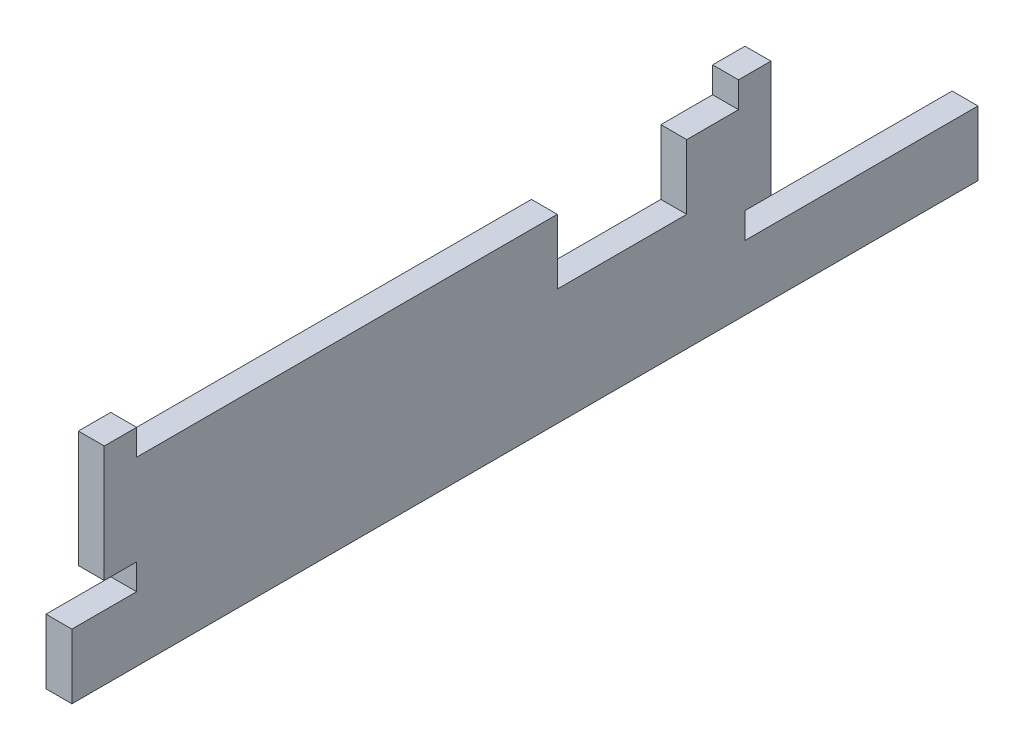
ISO-10303-21;
HEADER;
FILE_DESCRIPTION(('STEP AP214'),'2;1');
FILE_NAME('part.step','',(''),(''),'','','');
FILE_SCHEMA(('AUTOMOTIVE_DESIGN { 1 0 10303 214 1 1 1 1 }'));
ENDSEC;
DATA;
#1=APPLICATION_CONTEXT('core data for automotive mechanical design processes');
#2=APPLICATION_PROTOCOL_DEFINITION('international standard','automotive_design',2000,#1);
#3=PRODUCT_CONTEXT('',#1,'mechanical');
#4=PRODUCT('Part','Part','',(#3));
#5=PRODUCT_RELATED_PRODUCT_CATEGORY('part','',(#4));
#6=PRODUCT_DEFINITION_FORMATION('','',#4);
#7=PRODUCT_DEFINITION_CONTEXT('part definition',#1,'design');
#8=PRODUCT_DEFINITION('design','',#6,#7);
#9=PRODUCT_DEFINITION_SHAPE('','',#8);
#10=(LENGTH_UNIT() NAMED_UNIT(*) SI_UNIT(.MILLI.,.METRE.));
#11=(NAMED_UNIT(*) PLANE_ANGLE_UNIT() SI_UNIT($,.RADIAN.));
#12=(NAMED_UNIT(*) SI_UNIT($,.STERADIAN.) SOLID_ANGLE_UNIT());
#13=UNCERTAINTY_MEASURE_WITH_UNIT(LENGTH_MEASURE(1.E-05),#10,'distance_accuracy_value','');
#14=(GEOMETRIC_REPRESENTATION_CONTEXT(3) GLOBAL_UNCERTAINTY_ASSIGNED_CONTEXT((#13)) GLOBAL_UNIT_ASSIGNED_CONTEXT((#10,
#11,#12)) REPRESENTATION_CONTEXT('',''));
#15=CARTESIAN_POINT('',(0.,0.,0.));
#16=DIRECTION('',(0.,0.,1.));
#17=DIRECTION('',(1.,0.,0.));
#18=AXIS2_PLACEMENT_3D('',#15,#16,#17);
#19=CARTESIAN_POINT('',(4.,9.34482146794553,25.8310136523351));
#20=DIRECTION('',(0.,-1.,0.));
#21=DIRECTION('',(0.,0.,-1.));
#22=AXIS2_PLACEMENT_3D('',#19,#20,#21);
#23=PLANE('',#22);
#24=DIRECTION('',(0.,0.,1.));
#25=VECTOR('',#24,1.);
#26=CARTESIAN_POINT('',(0.,9.34482146794553,25.8310136523351));
#27=LINE('',#26,#25);
#28=CARTESIAN_POINT('',(0.,9.34482146794553,5.83101365233506));
#29=VERTEX_POINT('',#28);
#30=CARTESIAN_POINT('',(0.,9.34482146794553,25.8310136523351));
#31=VERTEX_POINT('',#30);
#32=EDGE_CURVE('E212',#29,#31,#27,.T.);
#33=ORIENTED_EDGE('',*,*,#32,.T.);
#34=DIRECTION('',(-1.,0.,0.));
#35=VECTOR('',#34,1.);
#36=CARTESIAN_POINT('',(4.,9.34482146794553,25.8310136523351));
#37=LINE('',#36,#35);
#38=CARTESIAN_POINT('',(4.,9.34482146794553,25.8310136523351));
#39=VERTEX_POINT('',#38);
#40=EDGE_CURVE('E11',#39,#31,#37,.T.);
#41=ORIENTED_EDGE('',*,*,#40,.F.);
#42=DIRECTION('',(0.,0.,1.));
#43=VECTOR('',#42,1.);
#44=CARTESIAN_POINT('',(4.,9.34482146794553,25.8310136523351));
#45=LINE('',#44,#43);
#46=CARTESIAN_POINT('',(4.,9.34482146794553,5.83101365233506));
#47=VERTEX_POINT('',#46);
#48=EDGE_CURVE('E270',#47,#39,#45,.T.);
#49=ORIENTED_EDGE('',*,*,#48,.F.);
#50=DIRECTION('',(-1.,0.,0.));
#51=VECTOR('',#50,1.);
#52=CARTESIAN_POINT('',(4.,9.34482146794553,5.83101365233506));
#53=LINE('',#52,#51);
#54=EDGE_CURVE('E208',#47,#29,#53,.T.);
#55=ORIENTED_EDGE('',*,*,#54,.T.);
#56=EDGE_LOOP('',(#33,#41,#49,#55));
#57=FACE_BOUND('',#56,.T.);
#58=ADVANCED_FACE('F39',(#57),#23,.F.);
#59=CARTESIAN_POINT('',(4.,19.3448214679455,25.8310136523351));
#60=DIRECTION('',(0.,0.,1.));
#61=DIRECTION('',(1.,0.,0.));
#62=AXIS2_PLACEMENT_3D('',#59,#60,#61);
#63=PLANE('',#62);
#64=DIRECTION('',(0.,1.,0.));
#65=VECTOR('',#64,1.);
#66=CARTESIAN_POINT('',(0.,19.3448214679455,25.8310136523351));
#67=LINE('',#66,#65);
#68=CARTESIAN_POINT('',(0.,19.3448214679455,25.8310136523351));
#69=VERTEX_POINT('',#68);
#70=EDGE_CURVE('E216',#31,#69,#67,.T.);
#71=ORIENTED_EDGE('',*,*,#70,.T.);
#72=DIRECTION('',(-1.,0.,0.));
#73=VECTOR('',#72,1.);
#74=CARTESIAN_POINT('',(4.,19.3448214679455,25.8310136523351));
#75=LINE('',#74,#73);
#76=CARTESIAN_POINT('',(4.,19.3448214679455,25.8310136523351));
#77=VERTEX_POINT('',#76);
#78=EDGE_CURVE('E48',#77,#69,#75,.T.);
#79=ORIENTED_EDGE('',*,*,#78,.F.);
#80=DIRECTION('',(0.,1.,0.));
#81=VECTOR('',#80,1.);
#82=CARTESIAN_POINT('',(4.,19.3448214679455,25.8310136523351));
#83=LINE('',#82,#81);
#84=EDGE_CURVE('E135',#39,#77,#83,.T.);
#85=ORIENTED_EDGE('',*,*,#84,.F.);
#86=ORIENTED_EDGE('',*,*,#40,.T.);
#87=EDGE_LOOP('',(#71,#79,#85,#86));
#88=FACE_BOUND('',#87,.T.);
#89=ADVANCED_FACE('F420',(#88),#63,.F.);
#90=CARTESIAN_POINT('',(4.,19.3448214679455,90.8310136523351));
#91=DIRECTION('',(0.,-1.,0.));
#92=DIRECTION('',(0.,0.,-1.));
#93=AXIS2_PLACEMENT_3D('',#90,#91,#92);
#94=PLANE('',#93);
#95=DIRECTION('',(0.,0.,1.));
#96=VECTOR('',#95,1.);
#97=CARTESIAN_POINT('',(0.,19.3448214679455,90.8310136523351));
#98=LINE('',#97,#96);
#99=CARTESIAN_POINT('',(0.,19.3448214679455,90.8310136523351));
#100=VERTEX_POINT('',#99);
#101=EDGE_CURVE('E219',#69,#100,#98,.T.);
#102=ORIENTED_EDGE('',*,*,#101,.T.);
#103=DIRECTION('',(-1.,0.,0.));
#104=VECTOR('',#103,1.);
#105=CARTESIAN_POINT('',(4.,19.3448214679455,90.8310136523351));
#106=LINE('',#105,#104);
#107=CARTESIAN_POINT('',(4.,19.3448214679455,90.8310136523351));
#108=VERTEX_POINT('',#107);
#109=EDGE_CURVE('E329',#108,#100,#106,.T.);
#110=ORIENTED_EDGE('',*,*,#109,.F.);
#111=DIRECTION('',(0.,0.,1.));
#112=VECTOR('',#111,1.);
#113=CARTESIAN_POINT('',(4.,19.3448214679455,90.8310136523351));
#114=LINE('',#113,#112);
#115=EDGE_CURVE('E339',#77,#108,#114,.T.);
#116=ORIENTED_EDGE('',*,*,#115,.F.);
#117=ORIENTED_EDGE('',*,*,#78,.T.);
#118=EDGE_LOOP('',(#102,#110,#116,#117));
#119=FACE_BOUND('',#118,.T.);
#120=ADVANCED_FACE('F337',(#119),#94,.F.);
#121=CARTESIAN_POINT('',(4.,19.3448214679455,90.8310136523351));
#122=DIRECTION('',(0.,0.,1.));
#123=DIRECTION('',(0.,-1.,0.));
#124=AXIS2_PLACEMENT_3D('',#121,#122,#123);
#125=PLANE('',#124);
#126=DIRECTION('',(0.,1.,0.));
#127=VECTOR('',#126,1.);
#128=CARTESIAN_POINT('',(0.,19.3448214679455,90.8310136523351));
#129=LINE('',#128,#127);
#130=CARTESIAN_POINT('',(0.,23.3448214679455,90.831013652335));
#131=VERTEX_POINT('',#130);
#132=EDGE_CURVE('E222',#100,#131,#129,.T.);
#133=ORIENTED_EDGE('',*,*,#132,.T.);
#134=DIRECTION('',(-1.,0.,0.));
#135=VECTOR('',#134,1.);
#136=CARTESIAN_POINT('',(4.,23.3448214679455,90.831013652335));
#137=LINE('',#136,#135);
#138=CARTESIAN_POINT('',(4.,23.3448214679455,90.831013652335));
#139=VERTEX_POINT('',#138);
#140=EDGE_CURVE('E325',#139,#131,#137,.T.);
#141=ORIENTED_EDGE('',*,*,#140,.F.);
#142=DIRECTION('',(0.,1.,0.));
#143=VECTOR('',#142,1.);
#144=CARTESIAN_POINT('',(4.,19.3448214679455,90.8310136523351));
#145=LINE('',#144,#143);
#146=EDGE_CURVE('E358',#108,#139,#145,.T.);
#147=ORIENTED_EDGE('',*,*,#146,.F.);
#148=ORIENTED_EDGE('',*,*,#109,.T.);
#149=EDGE_LOOP('',(#133,#141,#147,#148));
#150=FACE_BOUND('',#149,.T.);
#151=ADVANCED_FACE('F348',(#150),#125,.F.);
#152=CARTESIAN_POINT('',(4.,23.3448214679455,90.831013652335));
#153=DIRECTION('',(0.,-1.,0.));
#154=DIRECTION('',(0.,0.,-1.));
#155=AXIS2_PLACEMENT_3D('',#152,#153,#154);
#156=PLANE('',#155);
#157=DIRECTION('',(0.,0.,1.));
#158=VECTOR('',#157,1.);
#159=CARTESIAN_POINT('',(0.,23.3448214679455,90.831013652335));
#160=LINE('',#159,#158);
#161=CARTESIAN_POINT('',(0.,23.3448214679455,95.8310136523351));
#162=VERTEX_POINT('',#161);
#163=EDGE_CURVE('E225',#131,#162,#160,.T.);
#164=ORIENTED_EDGE('',*,*,#163,.T.);
#165=DIRECTION('',(-1.,0.,0.));
#166=VECTOR('',#165,1.);
#167=CARTESIAN_POINT('',(4.,23.3448214679455,95.8310136523351));
#168=LINE('',#167,#166);
#169=CARTESIAN_POINT('',(4.,23.3448214679455,95.8310136523351));
#170=VERTEX_POINT('',#169);
#171=EDGE_CURVE('E321',#170,#162,#168,.T.);
#172=ORIENTED_EDGE('',*,*,#171,.F.);
#173=DIRECTION('',(0.,0.,1.));
#174=VECTOR('',#173,1.);
#175=CARTESIAN_POINT('',(4.,23.3448214679455,90.831013652335));
#176=LINE('',#175,#174);
#177=EDGE_CURVE('E354',#139,#170,#176,.T.);
#178=ORIENTED_EDGE('',*,*,#177,.F.);
#179=ORIENTED_EDGE('',*,*,#140,.T.);
#180=EDGE_LOOP('',(#164,#172,#178,#179));
#181=FACE_BOUND('',#180,.T.);
#182=ADVANCED_FACE('F352',(#181),#156,.F.);
#183=CARTESIAN_POINT('',(4.,23.3448214679455,95.8310136523351));
#184=DIRECTION('',(0.,0.,-1.));
#185=DIRECTION('',(0.,1.,0.));
#186=AXIS2_PLACEMENT_3D('',#183,#184,#185);
#187=PLANE('',#186);
#188=DIRECTION('',(0.,-1.,0.));
#189=VECTOR('',#188,1.);
#190=CARTESIAN_POINT('',(0.,23.3448214679455,95.8310136523351));
#191=LINE('',#190,#189);
#192=CARTESIAN_POINT('',(0.,5.34482146794554,95.8310136523351));
#193=VERTEX_POINT('',#192);
#194=EDGE_CURVE('E228',#162,#193,#191,.T.);
#195=ORIENTED_EDGE('',*,*,#194,.T.);
#196=DIRECTION('',(-1.,0.,0.));
#197=VECTOR('',#196,1.);
#198=CARTESIAN_POINT('',(4.,5.34482146794554,95.8310136523351));
#199=LINE('',#198,#197);
#200=CARTESIAN_POINT('',(4.,5.34482146794554,95.8310136523351));
#201=VERTEX_POINT('',#200);
#202=EDGE_CURVE('E317',#201,#193,#199,.T.);
#203=ORIENTED_EDGE('',*,*,#202,.F.);
#204=DIRECTION('',(0.,-1.,0.));
#205=VECTOR('',#204,1.);
#206=CARTESIAN_POINT('',(4.,23.3448214679455,95.8310136523351));
#207=LINE('',#206,#205);
#208=EDGE_CURVE('E357',#170,#201,#207,.T.);
#209=ORIENTED_EDGE('',*,*,#208,.F.);
#210=ORIENTED_EDGE('',*,*,#171,.T.);
#211=EDGE_LOOP('',(#195,#203,#209,#210));
#212=FACE_BOUND('',#211,.T.);
#213=ADVANCED_FACE('F433',(#212),#187,.F.);
#214=CARTESIAN_POINT('',(4.,5.34482146794554,95.8310136523351));
#215=DIRECTION('',(0.,1.,0.));
#216=DIRECTION('',(0.,0.,1.));
#217=AXIS2_PLACEMENT_3D('',#214,#215,#216);
#218=PLANE('',#217);
#219=DIRECTION('',(0.,0.,-1.));
#220=VECTOR('',#219,1.);
#221=CARTESIAN_POINT('',(0.,5.34482146794554,95.8310136523351));
#222=LINE('',#221,#220);
#223=CARTESIAN_POINT('',(0.,5.34482146794554,90.8310136523351));
#224=VERTEX_POINT('',#223);
#225=EDGE_CURVE('E231',#193,#224,#222,.T.);
#226=ORIENTED_EDGE('',*,*,#225,.T.);
#227=DIRECTION('',(-1.,0.,0.));
#228=VECTOR('',#227,1.);
#229=CARTESIAN_POINT('',(4.,5.34482146794554,90.8310136523351));
#230=LINE('',#229,#228);
#231=CARTESIAN_POINT('',(4.,5.34482146794554,90.8310136523351));
#232=VERTEX_POINT('',#231);
#233=EDGE_CURVE('E313',#232,#224,#230,.T.);
#234=ORIENTED_EDGE('',*,*,#233,.F.);
#235=DIRECTION('',(0.,0.,-1.));
#236=VECTOR('',#235,1.);
#237=CARTESIAN_POINT('',(4.,5.34482146794554,95.8310136523351));
#238=LINE('',#237,#236);
#239=EDGE_CURVE('E362',#201,#232,#238,.T.);
#240=ORIENTED_EDGE('',*,*,#239,.F.);
#241=ORIENTED_EDGE('',*,*,#202,.T.);
#242=EDGE_LOOP('',(#226,#234,#240,#241));
#243=FACE_BOUND('',#242,.T.);
#244=ADVANCED_FACE('F436',(#243),#218,.F.);
#245=CARTESIAN_POINT('',(4.,5.34482146794554,90.8310136523351));
#246=DIRECTION('',(0.,0.,-1.));
#247=DIRECTION('',(-1.,0.,0.));
#248=AXIS2_PLACEMENT_3D('',#245,#246,#247);
#249=PLANE('',#248);
#250=DIRECTION('',(0.,-1.,0.));
#251=VECTOR('',#250,1.);
#252=CARTESIAN_POINT('',(0.,5.34482146794554,90.8310136523351));
#253=LINE('',#252,#251);
#254=CARTESIAN_POINT('',(0.,1.34482146794556,90.8310136523351));
#255=VERTEX_POINT('',#254);
#256=EDGE_CURVE('E234',#224,#255,#253,.T.);
#257=ORIENTED_EDGE('',*,*,#256,.T.);
#258=DIRECTION('',(-1.,0.,0.));
#259=VECTOR('',#258,1.);
#260=CARTESIAN_POINT('',(4.,1.34482146794556,90.8310136523351));
#261=LINE('',#260,#259);
#262=CARTESIAN_POINT('',(4.,1.34482146794556,90.8310136523351));
#263=VERTEX_POINT('',#262);
#264=EDGE_CURVE('E309',#263,#255,#261,.T.);
#265=ORIENTED_EDGE('',*,*,#264,.F.);
#266=DIRECTION('',(0.,-1.,0.));
#267=VECTOR('',#266,1.);
#268=CARTESIAN_POINT('',(4.,5.34482146794554,90.8310136523351));
#269=LINE('',#268,#267);
#270=EDGE_CURVE('E369',#232,#263,#269,.T.);
#271=ORIENTED_EDGE('',*,*,#270,.F.);
#272=ORIENTED_EDGE('',*,*,#233,.T.);
#273=EDGE_LOOP('',(#257,#265,#271,#272));
#274=FACE_BOUND('',#273,.T.);
#275=ADVANCED_FACE('F440',(#274),#249,.F.);
#276=CARTESIAN_POINT('',(4.,1.34482146794556,90.8310136523351));
#277=DIRECTION('',(0.,-1.,0.));
#278=DIRECTION('',(0.,0.,-1.));
#279=AXIS2_PLACEMENT_3D('',#276,#277,#278);
#280=PLANE('',#279);
#281=DIRECTION('',(0.,0.,1.));
#282=VECTOR('',#281,1.);
#283=CARTESIAN_POINT('',(0.,1.34482146794556,90.8310136523351));
#284=LINE('',#283,#282);
#285=CARTESIAN_POINT('',(0.,1.34482146794556,100.831013652335));
#286=VERTEX_POINT('',#285);
#287=EDGE_CURVE('E237',#255,#286,#284,.T.);
#288=ORIENTED_EDGE('',*,*,#287,.T.);
#289=DIRECTION('',(-1.,0.,0.));
#290=VECTOR('',#289,1.);
#291=CARTESIAN_POINT('',(4.,1.34482146794556,100.831013652335));
#292=LINE('',#291,#290);
#293=CARTESIAN_POINT('',(4.,1.34482146794556,100.831013652335));
#294=VERTEX_POINT('',#293);
#295=EDGE_CURVE('E305',#294,#286,#292,.T.);
#296=ORIENTED_EDGE('',*,*,#295,.F.);
#297=DIRECTION('',(0.,0.,1.));
#298=VECTOR('',#297,1.);
#299=CARTESIAN_POINT('',(4.,1.34482146794556,90.8310136523351));
#300=LINE('',#299,#298);
#301=EDGE_CURVE('E372',#263,#294,#300,.T.);
#302=ORIENTED_EDGE('',*,*,#301,.F.);
#303=ORIENTED_EDGE('',*,*,#264,.T.);
#304=EDGE_LOOP('',(#288,#296,#302,#303));
#305=FACE_BOUND('',#304,.T.);
#306=ADVANCED_FACE('F444',(#305),#280,.F.);
#307=CARTESIAN_POINT('',(4.,1.34482146794556,100.831013652335));
#308=DIRECTION('',(0.,0.,-1.));
#309=DIRECTION('',(0.,1.,0.));
#310=AXIS2_PLACEMENT_3D('',#307,#308,#309);
#311=PLANE('',#310);
#312=DIRECTION('',(0.,-1.,0.));
#313=VECTOR('',#312,1.);
#314=CARTESIAN_POINT('',(0.,1.34482146794556,100.831013652335));
#315=LINE('',#314,#313);
#316=CARTESIAN_POINT('',(0.,-8.65517853205444,100.831013652335));
#317=VERTEX_POINT('',#316);
#318=EDGE_CURVE('E240',#286,#317,#315,.T.);
#319=ORIENTED_EDGE('',*,*,#318,.T.);
#320=DIRECTION('',(-1.,0.,0.));
#321=VECTOR('',#320,1.);
#322=CARTESIAN_POINT('',(4.,-8.65517853205444,100.831013652335));
#323=LINE('',#322,#321);
#324=CARTESIAN_POINT('',(4.,-8.65517853205444,100.831013652335));
#325=VERTEX_POINT('',#324);
#326=EDGE_CURVE('E301',#325,#317,#323,.T.);
#327=ORIENTED_EDGE('',*,*,#326,.F.);
#328=DIRECTION('',(0.,-1.,0.));
#329=VECTOR('',#328,1.);
#330=CARTESIAN_POINT('',(4.,1.34482146794556,100.831013652335));
#331=LINE('',#330,#329);
#332=EDGE_CURVE('E375',#294,#325,#331,.T.);
#333=ORIENTED_EDGE('',*,*,#332,.F.);
#334=ORIENTED_EDGE('',*,*,#295,.T.);
#335=EDGE_LOOP('',(#319,#327,#333,#334));
#336=FACE_BOUND('',#335,.T.);
#337=ADVANCED_FACE('F448',(#336),#311,.F.);
#338=CARTESIAN_POINT('',(4.,-8.65517853205444,100.831013652335));
#339=DIRECTION('',(0.,1.,0.));
#340=DIRECTION('',(0.,0.,1.));
#341=AXIS2_PLACEMENT_3D('',#338,#339,#340);
#342=PLANE('',#341);
#343=DIRECTION('',(0.,0.,-1.));
#344=VECTOR('',#343,1.);
#345=CARTESIAN_POINT('',(0.,-8.65517853205444,100.831013652335));
#346=LINE('',#345,#344);
#347=CARTESIAN_POINT('',(0.,-8.65517853205444,-39.168986347665));
#348=VERTEX_POINT('',#347);
#349=EDGE_CURVE('E243',#317,#348,#346,.T.);
#350=ORIENTED_EDGE('',*,*,#349,.T.);
#351=DIRECTION('',(-1.,0.,0.));
#352=VECTOR('',#351,1.);
#353=CARTESIAN_POINT('',(4.,-8.65517853205444,-39.168986347665));
#354=LINE('',#353,#352);
#355=CARTESIAN_POINT('',(4.,-8.65517853205444,-39.168986347665));
#356=VERTEX_POINT('',#355);
#357=EDGE_CURVE('E297',#356,#348,#354,.T.);
#358=ORIENTED_EDGE('',*,*,#357,.F.);
#359=DIRECTION('',(0.,0.,-1.));
#360=VECTOR('',#359,1.);
#361=CARTESIAN_POINT('',(4.,-8.65517853205444,100.831013652335));
#362=LINE('',#361,#360);
#363=EDGE_CURVE('E378',#325,#356,#362,.T.);
#364=ORIENTED_EDGE('',*,*,#363,.F.);
#365=ORIENTED_EDGE('',*,*,#326,.T.);
#366=EDGE_LOOP('',(#350,#358,#364,#365));
#367=FACE_BOUND('',#366,.T.);
#368=ADVANCED_FACE('F452',(#367),#342,.F.);
#369=CARTESIAN_POINT('',(4.,1.34482146794548,-39.168986347665));
#370=DIRECTION('',(0.,0.,1.));
#371=DIRECTION('',(1.,0.,0.));
#372=AXIS2_PLACEMENT_3D('',#369,#370,#371);
#373=PLANE('',#372);
#374=DIRECTION('',(0.,1.,0.));
#375=VECTOR('',#374,1.);
#376=CARTESIAN_POINT('',(0.,1.34482146794548,-39.168986347665));
#377=LINE('',#376,#375);
#378=CARTESIAN_POINT('',(0.,1.34482146794548,-39.168986347665));
#379=VERTEX_POINT('',#378);
#380=EDGE_CURVE('E246',#348,#379,#377,.T.);
#381=ORIENTED_EDGE('',*,*,#380,.T.);
#382=DIRECTION('',(-1.,0.,0.));
#383=VECTOR('',#382,1.);
#384=CARTESIAN_POINT('',(4.,1.34482146794548,-39.168986347665));
#385=LINE('',#384,#383);
#386=CARTESIAN_POINT('',(4.,1.34482146794548,-39.168986347665));
#387=VERTEX_POINT('',#386);
#388=EDGE_CURVE('E293',#387,#379,#385,.T.);
#389=ORIENTED_EDGE('',*,*,#388,.F.);
#390=DIRECTION('',(0.,1.,0.));
#391=VECTOR('',#390,1.);
#392=CARTESIAN_POINT('',(4.,1.34482146794548,-39.168986347665));
#393=LINE('',#392,#391);
#394=EDGE_CURVE('E381',#356,#387,#393,.T.);
#395=ORIENTED_EDGE('',*,*,#394,.F.);
#396=ORIENTED_EDGE('',*,*,#357,.T.);
#397=EDGE_LOOP('',(#381,#389,#395,#396));
#398=FACE_BOUND('',#397,.T.);
#399=ADVANCED_FACE('F456',(#398),#373,.F.);
#400=CARTESIAN_POINT('',(4.,1.34482146794548,-3.16898634766494));
#401=DIRECTION('',(0.,-1.,0.));
#402=DIRECTION('',(0.,0.,-1.));
#403=AXIS2_PLACEMENT_3D('',#400,#401,#402);
#404=PLANE('',#403);
#405=DIRECTION('',(0.,0.,1.));
#406=VECTOR('',#405,1.);
#407=CARTESIAN_POINT('',(0.,1.34482146794548,-3.16898634766494));
#408=LINE('',#407,#406);
#409=CARTESIAN_POINT('',(0.,1.34482146794548,-3.16898634766494));
#410=VERTEX_POINT('',#409);
#411=EDGE_CURVE('E249',#379,#410,#408,.T.);
#412=ORIENTED_EDGE('',*,*,#411,.T.);
#413=DIRECTION('',(-1.,0.,0.));
#414=VECTOR('',#413,1.);
#415=CARTESIAN_POINT('',(4.,1.34482146794548,-3.16898634766494));
#416=LINE('',#415,#414);
#417=CARTESIAN_POINT('',(4.,1.34482146794548,-3.16898634766494));
#418=VERTEX_POINT('',#417);
#419=EDGE_CURVE('E289',#418,#410,#416,.T.);
#420=ORIENTED_EDGE('',*,*,#419,.F.);
#421=DIRECTION('',(0.,0.,1.));
#422=VECTOR('',#421,1.);
#423=CARTESIAN_POINT('',(4.,1.34482146794548,-3.16898634766494));
#424=LINE('',#423,#422);
#425=EDGE_CURVE('E384',#387,#418,#424,.T.);
#426=ORIENTED_EDGE('',*,*,#425,.F.);
#427=ORIENTED_EDGE('',*,*,#388,.T.);
#428=EDGE_LOOP('',(#412,#420,#426,#427));
#429=FACE_BOUND('',#428,.T.);
#430=ADVANCED_FACE('F460',(#429),#404,.F.);
#431=CARTESIAN_POINT('',(4.,5.34482146794548,-3.16898634766494));
#432=DIRECTION('',(0.,0.,1.));
#433=DIRECTION('',(1.,0.,0.));
#434=AXIS2_PLACEMENT_3D('',#431,#432,#433);
#435=PLANE('',#434);
#436=DIRECTION('',(0.,1.,0.));
#437=VECTOR('',#436,1.);
#438=CARTESIAN_POINT('',(0.,5.34482146794548,-3.16898634766494));
#439=LINE('',#438,#437);
#440=CARTESIAN_POINT('',(0.,5.34482146794548,-3.16898634766494));
#441=VERTEX_POINT('',#440);
#442=EDGE_CURVE('E252',#410,#441,#439,.T.);
#443=ORIENTED_EDGE('',*,*,#442,.T.);
#444=DIRECTION('',(-1.,0.,0.));
#445=VECTOR('',#444,1.);
#446=CARTESIAN_POINT('',(4.,5.34482146794548,-3.16898634766494));
#447=LINE('',#446,#445);
#448=CARTESIAN_POINT('',(4.,5.34482146794548,-3.16898634766494));
#449=VERTEX_POINT('',#448);
#450=EDGE_CURVE('E285',#449,#441,#447,.T.);
#451=ORIENTED_EDGE('',*,*,#450,.F.);
#452=DIRECTION('',(0.,1.,0.));
#453=VECTOR('',#452,1.);
#454=CARTESIAN_POINT('',(4.,5.34482146794548,-3.16898634766494));
#455=LINE('',#454,#453);
#456=EDGE_CURVE('E387',#418,#449,#455,.T.);
#457=ORIENTED_EDGE('',*,*,#456,.F.);
#458=ORIENTED_EDGE('',*,*,#419,.T.);
#459=EDGE_LOOP('',(#443,#451,#457,#458));
#460=FACE_BOUND('',#459,.T.);
#461=ADVANCED_FACE('F464',(#460),#435,.F.);
#462=CARTESIAN_POINT('',(4.,5.34482146794549,-7.16898634766494));
#463=DIRECTION('',(0.,1.,0.));
#464=DIRECTION('',(0.,0.,1.));
#465=AXIS2_PLACEMENT_3D('',#462,#463,#464);
#466=PLANE('',#465);
#467=DIRECTION('',(0.,0.,-1.));
#468=VECTOR('',#467,1.);
#469=CARTESIAN_POINT('',(0.,5.34482146794549,-7.16898634766494));
#470=LINE('',#469,#468);
#471=CARTESIAN_POINT('',(0.,5.34482146794549,-7.16898634766494));
#472=VERTEX_POINT('',#471);
#473=EDGE_CURVE('E255',#441,#472,#470,.T.);
#474=ORIENTED_EDGE('',*,*,#473,.T.);
#475=DIRECTION('',(-1.,0.,0.));
#476=VECTOR('',#475,1.);
#477=CARTESIAN_POINT('',(4.,5.34482146794549,-7.16898634766494));
#478=LINE('',#477,#476);
#479=CARTESIAN_POINT('',(4.,5.34482146794549,-7.16898634766494));
#480=VERTEX_POINT('',#479);
#481=EDGE_CURVE('E281',#480,#472,#478,.T.);
#482=ORIENTED_EDGE('',*,*,#481,.F.);
#483=DIRECTION('',(0.,0.,-1.));
#484=VECTOR('',#483,1.);
#485=CARTESIAN_POINT('',(4.,5.34482146794549,-7.16898634766494));
#486=LINE('',#485,#484);
#487=EDGE_CURVE('E390',#449,#480,#486,.T.);
#488=ORIENTED_EDGE('',*,*,#487,.F.);
#489=ORIENTED_EDGE('',*,*,#450,.T.);
#490=EDGE_LOOP('',(#474,#482,#488,#489));
#491=FACE_BOUND('',#490,.T.);
#492=ADVANCED_FACE('F468',(#491),#466,.F.);
#493=CARTESIAN_POINT('',(4.,23.3448214679455,-7.16898634766494));
#494=DIRECTION('',(0.,0.,1.));
#495=DIRECTION('',(0.,-1.,0.));
#496=AXIS2_PLACEMENT_3D('',#493,#494,#495);
#497=PLANE('',#496);
#498=DIRECTION('',(0.,1.,0.));
#499=VECTOR('',#498,1.);
#500=CARTESIAN_POINT('',(0.,23.3448214679455,-7.16898634766494));
#501=LINE('',#500,#499);
#502=CARTESIAN_POINT('',(0.,23.3448214679455,-7.16898634766494));
#503=VERTEX_POINT('',#502);
#504=EDGE_CURVE('E258',#472,#503,#501,.T.);
#505=ORIENTED_EDGE('',*,*,#504,.T.);
#506=DIRECTION('',(-1.,0.,0.));
#507=VECTOR('',#506,1.);
#508=CARTESIAN_POINT('',(4.,23.3448214679455,-7.16898634766494));
#509=LINE('',#508,#507);
#510=CARTESIAN_POINT('',(4.,23.3448214679455,-7.16898634766494));
#511=VERTEX_POINT('',#510);
#512=EDGE_CURVE('E277',#511,#503,#509,.T.);
#513=ORIENTED_EDGE('',*,*,#512,.F.);
#514=DIRECTION('',(0.,1.,0.));
#515=VECTOR('',#514,1.);
#516=CARTESIAN_POINT('',(4.,23.3448214679455,-7.16898634766494));
#517=LINE('',#516,#515);
#518=EDGE_CURVE('E393',#480,#511,#517,.T.);
#519=ORIENTED_EDGE('',*,*,#518,.F.);
#520=ORIENTED_EDGE('',*,*,#481,.T.);
#521=EDGE_LOOP('',(#505,#513,#519,#520));
#522=FACE_BOUND('',#521,.T.);
#523=ADVANCED_FACE('F401',(#522),#497,.F.);
#524=CARTESIAN_POINT('',(4.,23.3448214679455,-2.16898634766494));
#525=DIRECTION('',(0.,-1.,0.));
#526=DIRECTION('',(0.,0.,-1.));
#527=AXIS2_PLACEMENT_3D('',#524,#525,#526);
#528=PLANE('',#527);
#529=DIRECTION('',(0.,0.,1.));
#530=VECTOR('',#529,1.);
#531=CARTESIAN_POINT('',(0.,23.3448214679455,-2.16898634766494));
#532=LINE('',#531,#530);
#533=CARTESIAN_POINT('',(0.,23.3448214679455,-2.16898634766494));
#534=VERTEX_POINT('',#533);
#535=EDGE_CURVE('E261',#503,#534,#532,.T.);
#536=ORIENTED_EDGE('',*,*,#535,.T.);
#537=DIRECTION('',(-1.,0.,0.));
#538=VECTOR('',#537,1.);
#539=CARTESIAN_POINT('',(4.,23.3448214679455,-2.16898634766494));
#540=LINE('',#539,#538);
#541=CARTESIAN_POINT('',(4.,23.3448214679455,-2.16898634766494));
#542=VERTEX_POINT('',#541);
#543=EDGE_CURVE('E201',#542,#534,#540,.T.);
#544=ORIENTED_EDGE('',*,*,#543,.F.);
#545=DIRECTION('',(0.,0.,1.));
#546=VECTOR('',#545,1.);
#547=CARTESIAN_POINT('',(4.,23.3448214679455,-2.16898634766494));
#548=LINE('',#547,#546);
#549=EDGE_CURVE('E190',#511,#542,#548,.T.);
#550=ORIENTED_EDGE('',*,*,#549,.F.);
#551=ORIENTED_EDGE('',*,*,#512,.T.);
#552=EDGE_LOOP('',(#536,#544,#550,#551));
#553=FACE_BOUND('',#552,.T.);
#554=ADVANCED_FACE('F405',(#553),#528,.F.);
#555=CARTESIAN_POINT('',(4.,19.3448214679455,-2.16898634766494));
#556=DIRECTION('',(0.,0.,-1.));
#557=DIRECTION('',(-1.,0.,0.));
#558=AXIS2_PLACEMENT_3D('',#555,#556,#557);
#559=PLANE('',#558);
#560=DIRECTION('',(0.,-1.,0.));
#561=VECTOR('',#560,1.);
#562=CARTESIAN_POINT('',(0.,19.3448214679455,-2.16898634766494));
#563=LINE('',#562,#561);
#564=CARTESIAN_POINT('',(0.,19.3448214679455,-2.16898634766494));
#565=VERTEX_POINT('',#564);
#566=EDGE_CURVE('E199',#534,#565,#563,.T.);
#567=ORIENTED_EDGE('',*,*,#566,.T.);
#568=DIRECTION('',(-1.,0.,0.));
#569=VECTOR('',#568,1.);
#570=CARTESIAN_POINT('',(4.,19.3448214679455,-2.16898634766494));
#571=LINE('',#570,#569);
#572=CARTESIAN_POINT('',(4.,19.3448214679455,-2.16898634766494));
#573=VERTEX_POINT('',#572);
#574=EDGE_CURVE('E196',#573,#565,#571,.T.);
#575=ORIENTED_EDGE('',*,*,#574,.F.);
#576=DIRECTION('',(0.,-1.,0.));
#577=VECTOR('',#576,1.);
#578=CARTESIAN_POINT('',(4.,19.3448214679455,-2.16898634766494));
#579=LINE('',#578,#577);
#580=EDGE_CURVE('E184',#542,#573,#579,.T.);
#581=ORIENTED_EDGE('',*,*,#580,.F.);
#582=ORIENTED_EDGE('',*,*,#543,.T.);
#583=EDGE_LOOP('',(#567,#575,#581,#582));
#584=FACE_BOUND('',#583,.T.);
#585=ADVANCED_FACE('F197',(#584),#559,.F.);
#586=CARTESIAN_POINT('',(4.,19.3448214679455,5.83101365233506));
#587=DIRECTION('',(0.,-1.,0.));
#588=DIRECTION('',(0.,0.,-1.));
#589=AXIS2_PLACEMENT_3D('',#586,#587,#588);
#590=PLANE('',#589);
#591=DIRECTION('',(0.,0.,1.));
#592=VECTOR('',#591,1.);
#593=CARTESIAN_POINT('',(0.,19.3448214679455,5.83101365233506));
#594=LINE('',#593,#592);
#595=CARTESIAN_POINT('',(0.,19.3448214679455,5.83101365233506));
#596=VERTEX_POINT('',#595);
#597=EDGE_CURVE('E121',#565,#596,#594,.T.);
#598=ORIENTED_EDGE('',*,*,#597,.T.);
#599=DIRECTION('',(-1.,0.,0.));
#600=VECTOR('',#599,1.);
#601=CARTESIAN_POINT('',(4.,19.3448214679455,5.83101365233506));
#602=LINE('',#601,#600);
#603=CARTESIAN_POINT('',(4.,19.3448214679455,5.83101365233506));
#604=VERTEX_POINT('',#603);
#605=EDGE_CURVE('E202',#604,#596,#602,.T.);
#606=ORIENTED_EDGE('',*,*,#605,.F.);
#607=DIRECTION('',(0.,0.,1.));
#608=VECTOR('',#607,1.);
#609=CARTESIAN_POINT('',(4.,19.3448214679455,5.83101365233506));
#610=LINE('',#609,#608);
#611=EDGE_CURVE('E188',#573,#604,#610,.T.);
#612=ORIENTED_EDGE('',*,*,#611,.F.);
#613=ORIENTED_EDGE('',*,*,#574,.T.);
#614=EDGE_LOOP('',(#598,#606,#612,#613));
#615=FACE_BOUND('',#614,.T.);
#616=ADVANCED_FACE('F204',(#615),#590,.F.);
#617=CARTESIAN_POINT('',(4.,9.34482146794553,5.83101365233506));
#618=DIRECTION('',(0.,0.,-1.));
#619=DIRECTION('',(-1.,0.,0.));
#620=AXIS2_PLACEMENT_3D('',#617,#618,#619);
#621=PLANE('',#620);
#622=DIRECTION('',(0.,-1.,0.));
#623=VECTOR('',#622,1.);
#624=CARTESIAN_POINT('',(0.,9.34482146794553,5.83101365233506));
#625=LINE('',#624,#623);
#626=EDGE_CURVE('E127',#596,#29,#625,.T.);
#627=ORIENTED_EDGE('',*,*,#626,.T.);
#628=ORIENTED_EDGE('',*,*,#54,.F.);
#629=DIRECTION('',(0.,-1.,0.));
#630=VECTOR('',#629,1.);
#631=CARTESIAN_POINT('',(4.,9.34482146794553,5.83101365233506));
#632=LINE('',#631,#630);
#633=EDGE_CURVE('E56',#604,#47,#632,.T.);
#634=ORIENTED_EDGE('',*,*,#633,.F.);
#635=ORIENTED_EDGE('',*,*,#605,.T.);
#636=EDGE_LOOP('',(#627,#628,#634,#635));
#637=FACE_BOUND('',#636,.T.);
#638=ADVANCED_FACE('F409',(#637),#621,.F.);
#639=CARTESIAN_POINT('',(4.,0.,0.));
#640=DIRECTION('',(1.,0.,0.));
#641=DIRECTION('',(0.,0.,-1.));
#642=AXIS2_PLACEMENT_3D('',#639,#640,#641);
#643=PLANE('',#642);
#644=ORIENTED_EDGE('',*,*,#48,.T.);
#645=ORIENTED_EDGE('',*,*,#84,.T.);
#646=ORIENTED_EDGE('',*,*,#115,.T.);
#647=ORIENTED_EDGE('',*,*,#146,.T.);
#648=ORIENTED_EDGE('',*,*,#177,.T.);
#649=ORIENTED_EDGE('',*,*,#208,.T.);
#650=ORIENTED_EDGE('',*,*,#239,.T.);
#651=ORIENTED_EDGE('',*,*,#270,.T.);
#652=ORIENTED_EDGE('',*,*,#301,.T.);
#653=ORIENTED_EDGE('',*,*,#332,.T.);
#654=ORIENTED_EDGE('',*,*,#363,.T.);
#655=ORIENTED_EDGE('',*,*,#394,.T.);
#656=ORIENTED_EDGE('',*,*,#425,.T.);
#657=ORIENTED_EDGE('',*,*,#456,.T.);
#658=ORIENTED_EDGE('',*,*,#487,.T.);
#659=ORIENTED_EDGE('',*,*,#518,.T.);
#660=ORIENTED_EDGE('',*,*,#549,.T.);
#661=ORIENTED_EDGE('',*,*,#580,.T.);
#662=ORIENTED_EDGE('',*,*,#611,.T.);
#663=ORIENTED_EDGE('',*,*,#633,.T.);
#664=EDGE_LOOP('',(#644,#645,#646,#647,#648,#649,#650,#651,#652,#653,#654,#655,#656,#657,#658,
#659,#660,#661,#662,#663));
#665=FACE_BOUND('',#664,.T.);
#666=ADVANCED_FACE('F186',(#665),#643,.T.);
#667=CARTESIAN_POINT('',(0.,0.,0.));
#668=DIRECTION('',(1.,0.,0.));
#669=DIRECTION('',(0.,0.,-1.));
#670=AXIS2_PLACEMENT_3D('',#667,#668,#669);
#671=PLANE('',#670);
#672=ORIENTED_EDGE('',*,*,#32,.F.);
#673=ORIENTED_EDGE('',*,*,#626,.F.);
#674=ORIENTED_EDGE('',*,*,#597,.F.);
#675=ORIENTED_EDGE('',*,*,#566,.F.);
#676=ORIENTED_EDGE('',*,*,#535,.F.);
#677=ORIENTED_EDGE('',*,*,#504,.F.);
#678=ORIENTED_EDGE('',*,*,#473,.F.);
#679=ORIENTED_EDGE('',*,*,#442,.F.);
#680=ORIENTED_EDGE('',*,*,#411,.F.);
#681=ORIENTED_EDGE('',*,*,#380,.F.);
#682=ORIENTED_EDGE('',*,*,#349,.F.);
#683=ORIENTED_EDGE('',*,*,#318,.F.);
#684=ORIENTED_EDGE('',*,*,#287,.F.);
#685=ORIENTED_EDGE('',*,*,#256,.F.);
#686=ORIENTED_EDGE('',*,*,#225,.F.);
#687=ORIENTED_EDGE('',*,*,#194,.F.);
#688=ORIENTED_EDGE('',*,*,#163,.F.);
#689=ORIENTED_EDGE('',*,*,#132,.F.);
#690=ORIENTED_EDGE('',*,*,#101,.F.);
#691=ORIENTED_EDGE('',*,*,#70,.F.);
#692=EDGE_LOOP('',(#672,#673,#674,#675,#676,#677,#678,#679,#680,#681,#682,#683,#684,#685,#686,
#687,#688,#689,#690,#691));
#693=FACE_BOUND('',#692,.T.);
#694=ADVANCED_FACE('F343',(#693),#671,.F.);
#695=CLOSED_SHELL('',(#58,#89,#120,#151,#182,#213,#244,#275,#306,#337,#368,#399,#430,#461,#492,
#523,#554,#585,#616,#638,#666,#694));
#696=MANIFOLD_SOLID_BREP('B2',#695);
#697=ADVANCED_BREP_SHAPE_REPRESENTATION('',(#18,#696),#14);
#698=SHAPE_DEFINITION_REPRESENTATION(#9,#697);
ENDSEC;
END-ISO-10303-21;
